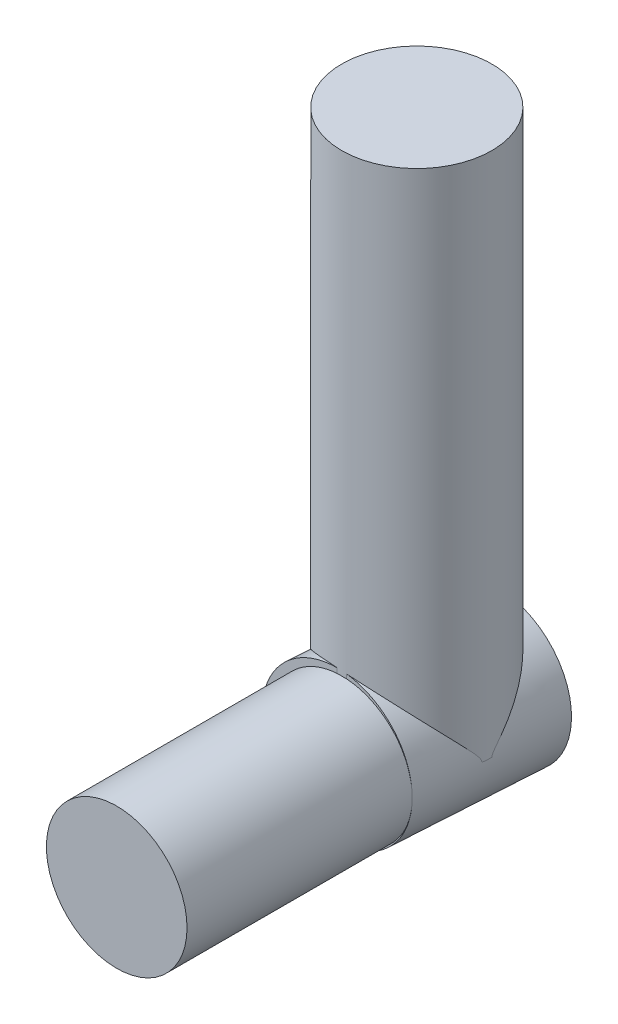
ISO-10303-21;
HEADER;
FILE_DESCRIPTION(('STEP AP214'),'2;1');
FILE_NAME('part.step','',(''),(''),'','','');
FILE_SCHEMA(('AUTOMOTIVE_DESIGN { 1 0 10303 214 1 1 1 1 }'));
ENDSEC;
DATA;
#1=APPLICATION_CONTEXT('core data for automotive mechanical design processes');
#2=APPLICATION_PROTOCOL_DEFINITION('international standard','automotive_design',2000,#1);
#3=PRODUCT_CONTEXT('',#1,'mechanical');
#4=PRODUCT('Part','Part','',(#3));
#5=PRODUCT_RELATED_PRODUCT_CATEGORY('part','',(#4));
#6=PRODUCT_DEFINITION_FORMATION('','',#4);
#7=PRODUCT_DEFINITION_CONTEXT('part definition',#1,'design');
#8=PRODUCT_DEFINITION('design','',#6,#7);
#9=PRODUCT_DEFINITION_SHAPE('','',#8);
#10=(LENGTH_UNIT() NAMED_UNIT(*) SI_UNIT(.MILLI.,.METRE.));
#11=(NAMED_UNIT(*) PLANE_ANGLE_UNIT() SI_UNIT($,.RADIAN.));
#12=(NAMED_UNIT(*) SI_UNIT($,.STERADIAN.) SOLID_ANGLE_UNIT());
#13=UNCERTAINTY_MEASURE_WITH_UNIT(LENGTH_MEASURE(1.E-05),#10,'distance_accuracy_value','');
#14=(GEOMETRIC_REPRESENTATION_CONTEXT(3) GLOBAL_UNCERTAINTY_ASSIGNED_CONTEXT((#13)) GLOBAL_UNIT_ASSIGNED_CONTEXT((#10,
#11,#12)) REPRESENTATION_CONTEXT('',''));
#15=CARTESIAN_POINT('',(0.,0.,0.));
#16=DIRECTION('',(0.,0.,1.));
#17=DIRECTION('',(1.,0.,0.));
#18=AXIS2_PLACEMENT_3D('',#15,#16,#17);
#19=CARTESIAN_POINT('',(0.,70.,0.));
#20=DIRECTION('',(0.,-1.,0.));
#21=DIRECTION('',(0.,0.,-1.));
#22=AXIS2_PLACEMENT_3D('',#19,#20,#21);
#23=CYLINDRICAL_SURFACE('',#22,10.);
#24=CARTESIAN_POINT('',(0.,70.,0.));
#25=DIRECTION('',(0.,1.,0.));
#26=DIRECTION('',(0.,0.,1.));
#27=AXIS2_PLACEMENT_3D('',#24,#25,#26);
#28=CIRCLE('',#27,10.);
#29=CARTESIAN_POINT('',(0.,70.,10.));
#30=VERTEX_POINT('',#29);
#31=EDGE_CURVE('E130',#30,#30,#28,.T.);
#32=ORIENTED_EDGE('',*,*,#31,.F.);
#33=EDGE_LOOP('',(#32));
#34=FACE_BOUND('',#33,.T.);
#35=CARTESIAN_POINT('',(0.631150203700423,9.34756631032858,9.98006259601456));
#36=CARTESIAN_POINT('',(0.420766802466949,9.36175530097585,9.99335419867152));
#37=CARTESIAN_POINT('',(0.210383401233475,9.36884979629949,10.));
#38=CARTESIAN_POINT('',(-0.210383401233474,9.36884979629949,10.));
#39=CARTESIAN_POINT('',(-0.420766802466949,9.36175530097585,9.99335419867152));
#40=CARTESIAN_POINT('',(-0.631150203700423,9.34756631032858,9.98006259601456));
#41=B_SPLINE_CURVE_WITH_KNOTS('',3,(#35,#36,#37,#38,#39,#40),.UNSPECIFIED.,.F.,.F.,(4,2,4),(0.,
0.631823603930589,1.26364720786118),.UNSPECIFIED.);
#42=CARTESIAN_POINT('',(0.631150203700456,9.34756631032858,9.98006259601456));
#43=VERTEX_POINT('',#42);
#44=CARTESIAN_POINT('',(-0.631150203700456,9.34756631032858,9.98006259601456));
#45=VERTEX_POINT('',#44);
#46=EDGE_CURVE('E107',#43,#45,#41,.T.);
#47=ORIENTED_EDGE('',*,*,#46,.F.);
#48=DIRECTION('',(0.,-1.,0.));
#49=VECTOR('',#48,1.);
#50=CARTESIAN_POINT('',(0.631150203700456,70.,9.98006259601456));
#51=LINE('',#50,#49);
#52=CARTESIAN_POINT('',(0.63115020370051,9.92000996377903,9.98006259601456));
#53=VERTEX_POINT('',#52);
#54=EDGE_CURVE('E116',#43,#53,#51,.F.);
#55=ORIENTED_EDGE('',*,*,#54,.T.);
#56=CARTESIAN_POINT('',(9.92032988407377,0.,1.25978370808361));
#57=CARTESIAN_POINT('',(9.92033242590106,0.0220756947974421,1.2597580282637));
#58=CARTESIAN_POINT('',(9.92018434000406,0.0441330122335639,1.26092989339208));
#59=CARTESIAN_POINT('',(9.91960776810244,0.0879510900172992,1.26546063143334));
#60=CARTESIAN_POINT('',(9.91918016515472,0.109712564718145,1.26881261669194));
#61=CARTESIAN_POINT('',(9.91807788951999,0.152328884043128,1.27739887250201));
#62=CARTESIAN_POINT('',(9.91740907290019,0.17319308715758,1.2825884799329));
#63=CARTESIAN_POINT('',(9.91585074428951,0.214453616032157,1.29458148435278));
#64=CARTESIAN_POINT('',(9.91496106127473,0.234849565775109,1.30138613173844));
#65=CARTESIAN_POINT('',(9.91178649424098,0.29970049418278,1.32542961452679));
#66=CARTESIAN_POINT('',(9.90912316114324,0.343166999184462,1.3452741631965));
#67=CARTESIAN_POINT('',(9.90308570803093,0.427952659449818,1.38902277296422));
#68=CARTESIAN_POINT('',(9.8997101730987,0.469267332894177,1.41293489643182));
#69=CARTESIAN_POINT('',(9.89231736121407,0.551068975588831,1.46380742524056));
#70=CARTESIAN_POINT('',(9.88828845742589,0.591522164228469,1.49081981763636));
#71=CARTESIAN_POINT('',(9.87973010855749,0.67112295519387,1.54652144913589));
#72=CARTESIAN_POINT('',(9.87520117198712,0.710271832136264,1.57520897097219));
#73=CARTESIAN_POINT('',(9.86339809914827,0.806288665779882,1.64781754573088));
#74=CARTESIAN_POINT('',(9.85585262738829,0.862606071147923,1.69241888943977));
#75=CARTESIAN_POINT('',(9.83985315935048,0.973918664803114,1.78309166237687));
#76=CARTESIAN_POINT('',(9.83139894853334,1.02891353709393,1.82916343693821));
#77=CARTESIAN_POINT('',(9.81361558936306,1.13804583686376,1.92229012267825));
#78=CARTESIAN_POINT('',(9.80428529926398,1.19218203485904,1.96934625289695));
#79=CARTESIAN_POINT('',(9.78478420727456,1.29977494566702,2.06405874418065));
#80=CARTESIAN_POINT('',(9.77461337026228,1.35323162997871,2.11171513025653));
#81=CARTESIAN_POINT('',(9.74285117897583,1.51289829880721,2.25531739170683));
#82=CARTESIAN_POINT('',(9.72002040696757,1.61834260674294,2.35184228459749));
#83=CARTESIAN_POINT('',(9.67132756624709,1.82698832241099,2.54464873348263));
#84=CARTESIAN_POINT('',(9.64549380682642,1.9302012867694,2.64092501268894));
#85=CARTESIAN_POINT('',(9.59067367970475,2.13556098676346,2.83354851790667));
#86=CARTESIAN_POINT('',(9.56168983159853,2.23770850395434,2.92989562688068));
#87=CARTESIAN_POINT('',(9.50055895633299,2.44115807863855,3.12243211921485));
#88=CARTESIAN_POINT('',(9.46841258219067,2.5424603060054,3.2186215309843));
#89=CARTESIAN_POINT('',(9.38409598612175,2.7947128727181,3.45861596867457));
#90=CARTESIAN_POINT('',(9.32994158891204,2.94519941853083,3.60221690693083));
#91=CARTESIAN_POINT('',(9.21441494878566,3.24457927293557,3.88823305327413));
#92=CARTESIAN_POINT('',(9.15304123506252,3.39347225010206,4.03064801338898));
#93=CARTESIAN_POINT('',(9.02288324759291,3.68982735484595,4.31415691390242));
#94=CARTESIAN_POINT('',(8.95408609520589,3.83728649580493,4.45524808153196));
#95=CARTESIAN_POINT('',(8.80907783758271,4.13034040535444,4.73550853023783));
#96=CARTESIAN_POINT('',(8.73286715524381,4.27593527975462,4.87467792042342));
#97=CARTESIAN_POINT('',(8.49289175364769,4.70972902210022,5.28891975401268));
#98=CARTESIAN_POINT('',(8.31779343724254,4.99491465937514,5.56070443571077));
#99=CARTESIAN_POINT('',(7.93646256955939,5.55488831602754,6.09258530069025));
#100=CARTESIAN_POINT('',(7.73024785824968,5.82968218114401,6.35268807139074));
#101=CARTESIAN_POINT('',(7.3178786155202,6.32711492077504,6.82138894697784));
#102=CARTESIAN_POINT('',(7.11610275355067,6.55151475092442,7.03196571834002));
#103=CARTESIAN_POINT('',(6.68814409782686,6.98868035011143,7.44017195604492));
#104=CARTESIAN_POINT('',(6.46196140127897,7.20144616547937,7.63780147394831));
#105=CARTESIAN_POINT('',(6.02234550747074,7.58013840160932,7.98731930252009));
#106=CARTESIAN_POINT('',(5.81253901080116,7.74815580163604,8.14150260860614));
#107=CARTESIAN_POINT('',(5.37515669480509,8.07200348770866,8.43665967977126));
#108=CARTESIAN_POINT('',(5.14759268067936,8.22784173481591,8.57764208593553));
#109=CARTESIAN_POINT('',(4.70871530811283,8.50381716113347,8.82507927814656));
#110=CARTESIAN_POINT('',(4.49976185897499,8.62586731065247,8.93358492674006));
#111=CARTESIAN_POINT('',(4.06883498695091,8.85805594853519,9.1379160667814));
#112=CARTESIAN_POINT('',(3.84684166219442,8.96817545905106,9.23372140866351));
#113=CARTESIAN_POINT('',(3.41515055287534,9.16353096962954,9.40130329266466));
#114=CARTESIAN_POINT('',(3.20665937064998,9.25016798566817,9.47455206441438));
#115=CARTESIAN_POINT('',(2.78094600002504,9.41103220547226,9.60812547147538));
#116=CARTESIAN_POINT('',(2.56372589446289,9.48526234812792,9.66845316843443));
#117=CARTESIAN_POINT('',(2.12209870731926,9.6199082367368,9.77487596900084));
#118=CARTESIAN_POINT('',(1.89770566322061,9.68034928212193,9.82099719317577));
#119=CARTESIAN_POINT('',(1.44299831680148,9.7863528020247,9.89802147040868));
#120=CARTESIAN_POINT('',(1.21268955113086,9.83192867843877,9.92893824409036));
#121=CARTESIAN_POINT('',(0.922414064452797,9.87898193016399,9.95753785794868));
#122=CARTESIAN_POINT('',(0.864292668973951,9.88788938100822,9.96275147125723));
#123=CARTESIAN_POINT('',(0.747865039608166,9.90470147025298,9.9721663247041));
#124=CARTESIAN_POINT('',(0.689558963225636,9.9126068049106,9.97636826958197));
#125=CARTESIAN_POINT('',(0.63115020370051,9.92000996377903,9.98006259601456));
#126=B_SPLINE_CURVE_WITH_KNOTS('',3,(#56,#57,#58,#59,#60,#61,#62,#63,#64,#65,#66,#67,#68,#69,
#70,#71,#72,#73,#74,#75,#76,#77,#78,#79,#80,#81,#82,#83,#84,#85,#86,#87,#88,#89,#90,#91,#92,#93,
#94,#95,#96,#97,#98,#99,#100,#101,#102,#103,#104,#105,#106,#107,#108,#109,#110,#111,#112,#113,
#114,#115,#116,#117,#118,#119,#120,#121,#122,#123,#124,#125),.UNSPECIFIED.,.F.,.F.,(4,2,2,2,2,2,
2,2,2,2,2,2,2,2,2,2,2,2,2,2,2,2,2,2,2,2,2,2,2,2,2,2,2,2,4),(0.,0.0661661674294887,
0.132124304863384,0.196578450275919,0.26108266111811,0.40423972562996,0.547683921590436,
0.69403733411846,0.840243259632868,1.0568906636945,1.27358932767939,1.49057443013833,
1.70756860382563,2.14180624545537,2.57223956623243,3.00233110445249,3.4323340204946,
4.07702404328514,4.72184563835633,5.36780446469225,6.01372646454948,7.30566760756282,
8.59687083650684,9.69973485431071,10.8025944798424,11.7313019179533,12.6593971267508,
13.4542005711128,14.2502502858769,14.9615622734043,15.6727055286849,16.382533334355,
17.0917194046606,17.2688006524312,17.4457581841745),.UNSPECIFIED.);
#127=CARTESIAN_POINT('',(9.92032988407376,0.,1.25978370808369));
#128=VERTEX_POINT('',#127);
#129=EDGE_CURVE('E153',#128,#53,#126,.T.);
#130=ORIENTED_EDGE('',*,*,#129,.F.);
#131=CARTESIAN_POINT('',(0.,0.,0.));
#132=DIRECTION('',(0.,1.,0.));
#133=DIRECTION('',(0.,0.,1.));
#134=AXIS2_PLACEMENT_3D('',#131,#132,#133);
#135=CIRCLE('',#134,10.);
#136=CARTESIAN_POINT('',(10.,0.,0.));
#137=VERTEX_POINT('',#136);
#138=EDGE_CURVE('E134',#128,#137,#135,.T.);
#139=ORIENTED_EDGE('',*,*,#138,.T.);
#140=CARTESIAN_POINT('',(0.631150203700509,10.,-9.98006259601456));
#141=CARTESIAN_POINT('',(0.742830827548324,10.0000016296547,-9.97300142290277));
#142=CARTESIAN_POINT('',(0.854375283150213,9.99811355991187,-9.96406291506445));
#143=CARTESIAN_POINT('',(1.0769692283195,9.99057907109058,-9.9424663750549));
#144=CARTESIAN_POINT('',(1.18801874837057,9.98493288679144,-9.92980857526523));
#145=CARTESIAN_POINT('',(1.5198832449709,9.96240390075529,-9.88633722595227));
#146=CARTESIAN_POINT('',(1.73964574342517,9.93993057480389,-9.85001098964358));
#147=CARTESIAN_POINT('',(2.17241386215286,9.88082076235326,-9.76365243273368));
#148=CARTESIAN_POINT('',(2.38546199110751,9.84431098802128,-9.71374386988338));
#149=CARTESIAN_POINT('',(2.80531306092513,9.75784954291677,-9.60091000635828));
#150=CARTESIAN_POINT('',(3.01211511229863,9.70789596758853,-9.53798286166005));
#151=CARTESIAN_POINT('',(3.41749632595821,9.59565032439707,-9.40034064242018));
#152=CARTESIAN_POINT('',(3.61609966127069,9.53339820983808,-9.32566389376065));
#153=CARTESIAN_POINT('',(4.00488643798395,9.39744967447637,-9.16543047318063));
#154=CARTESIAN_POINT('',(4.19506666756992,9.3237489356663,-9.07986969841289));
#155=CARTESIAN_POINT('',(4.56665822987374,9.16580006838072,-8.89878923526076));
#156=CARTESIAN_POINT('',(4.74804884113436,9.08152855097958,-8.80324754397401));
#157=CARTESIAN_POINT('',(5.10116090673585,8.90362239277449,-8.60344850511416));
#158=CARTESIAN_POINT('',(5.27288146628553,8.80998688771813,-8.49919035319829));
#159=CARTESIAN_POINT('',(5.67486116939111,8.57419780331867,-8.23859836688425));
#160=CARTESIAN_POINT('',(5.90023325614168,8.4278993818153,-8.07844809391049));
#161=CARTESIAN_POINT('',(6.33104896877123,8.12125437339223,-7.74544950253409));
#162=CARTESIAN_POINT('',(6.53649076127022,7.96090649664589,-7.57260001850127));
#163=CARTESIAN_POINT('',(6.92779073009154,7.62831620838957,-7.21635274799484));
#164=CARTESIAN_POINT('',(7.1136408669042,7.45606896155133,-7.03295067858041));
#165=CARTESIAN_POINT('',(7.46607800043684,7.10169946358894,-6.65762263848096));
#166=CARTESIAN_POINT('',(7.63267077994541,6.91958020118758,-6.46569925074758));
#167=CARTESIAN_POINT('',(7.95028262635964,6.54342908192741,-6.07111000641651));
#168=CARTESIAN_POINT('',(8.10094064734987,6.3492355015338,-5.86830855038069));
#169=CARTESIAN_POINT('',(8.38341993447173,5.9538611548067,-5.45714315324223));
#170=CARTESIAN_POINT('',(8.51526322409773,5.75268890612465,-5.24878606018127));
#171=CARTESIAN_POINT('',(8.821935266842,5.24300428664017,-4.72298356628904));
#172=CARTESIAN_POINT('',(8.98566402740072,4.93072728890385,-4.40267311983434));
#173=CARTESIAN_POINT('',(9.2749947133202,4.29552032877061,-3.75504362114587));
#174=CARTESIAN_POINT('',(9.40056368174093,3.97258142346712,-3.42771877055008));
#175=CARTESIAN_POINT('',(9.58598218136611,3.40704232997325,-2.85876762507608));
#176=CARTESIAN_POINT('',(9.65441962841038,3.16639299835617,-2.61796159946066));
#177=CARTESIAN_POINT('',(9.74283946381923,2.802431333076,-2.25664173398793));
#178=CARTESIAN_POINT('',(9.76992811283642,2.68068624734011,-2.13625505755867));
#179=CARTESIAN_POINT('',(9.81944642684829,2.43608177191856,-1.89566819860734));
#180=CARTESIAN_POINT('',(9.84187635959484,2.31322244669575,-1.77546800576176));
#181=CARTESIAN_POINT('',(9.88658407932886,2.03896526327545,-1.5091259133524));
#182=CARTESIAN_POINT('',(9.90773543002318,1.88725408540976,-1.3631143380007));
#183=CARTESIAN_POINT('',(9.93444594291909,1.65739174011257,-1.14549414771198));
#184=CARTESIAN_POINT('',(9.94252106698222,1.58027975755807,-1.0730874476194));
#185=CARTESIAN_POINT('',(9.95700206077707,1.42512603751127,-0.929156117581981));
#186=CARTESIAN_POINT('',(9.96340851463875,1.3470846353999,-0.85763118734258));
#187=CARTESIAN_POINT('',(9.9721277291919,1.22425647926387,-0.74716380547574));
#188=CARTESIAN_POINT('',(9.97500136483186,1.1799478852086,-0.707733480832518));
#189=CARTESIAN_POINT('',(9.98024560109061,1.09074629701172,-0.629472011340692));
#190=CARTESIAN_POINT('',(9.9826160285646,1.04585310734227,-0.590641076979192));
#191=CARTESIAN_POINT('',(9.9868667156041,0.955252830355158,-0.513785892912599));
#192=CARTESIAN_POINT('',(9.98874631568864,0.90954473526087,-0.475762790954648));
#193=CARTESIAN_POINT('',(9.99202439689919,0.817192190859294,-0.401050613616653));
#194=CARTESIAN_POINT('',(9.99342393134944,0.770550032287507,-0.364358777641774));
#195=CARTESIAN_POINT('',(9.99577262884016,0.675854804941674,-0.292924175962336));
#196=CARTESIAN_POINT('',(9.99672227012489,0.627803292317865,-0.258179375336574));
#197=CARTESIAN_POINT('',(9.99821477187555,0.529656915104847,-0.191812543147));
#198=CARTESIAN_POINT('',(9.99875845383924,0.47956639456944,-0.160184318160942));
#199=CARTESIAN_POINT('',(9.99929950150752,0.406126183735247,-0.119006955372882));
#200=CARTESIAN_POINT('',(9.9994310732103,0.384027828579707,-0.107250090774236));
#201=CARTESIAN_POINT('',(9.99964503752539,0.339210303455327,-0.0849860055166155));
#202=CARTESIAN_POINT('',(9.99972741478707,0.316490942018041,-0.0744791757364691));
#203=CARTESIAN_POINT('',(9.99991494109074,0.2476467589789,-0.0454984574862729));
#204=CARTESIAN_POINT('',(9.99996299632667,0.200449244933722,-0.0293344842347645));
#205=CARTESIAN_POINT('',(9.99999436676468,0.127323502902867,-0.0122439245373491));
#206=CARTESIAN_POINT('',(9.99999781613364,0.102235030998736,-0.00773040878097081));
#207=CARTESIAN_POINT('',(10.0000000169605,0.0514487318273774,-0.00157214493102014));
#208=CARTESIAN_POINT('',(9.99999871904256,0.0257472782050244,4.21900316416995E-05));
#209=CARTESIAN_POINT('',(10.,0.,0.));
#210=B_SPLINE_CURVE_WITH_KNOTS('',3,(#140,#141,#142,#143,#144,#145,#146,#147,#148,#149,#150,
#151,#152,#153,#154,#155,#156,#157,#158,#159,#160,#161,#162,#163,#164,#165,#166,#167,#168,#169,
#170,#171,#172,#173,#174,#175,#176,#177,#178,#179,#180,#181,#182,#183,#184,#185,#186,#187,#188,
#189,#190,#191,#192,#193,#194,#195,#196,#197,#198,#199,#200,#201,#202,#203,#204,#205,#206,#207,
#208,#209),.UNSPECIFIED.,.F.,.F.,(4,2,2,2,2,2,2,2,2,2,2,2,2,2,2,2,2,2,2,2,2,2,2,2,2,2,2,2,2,2,2,
2,2,2,4),(0.,0.335644816483024,0.671268666315846,1.34182303228847,2.00646104374489,
2.67119326271525,3.33380051250744,3.99665828332755,4.66100945728201,5.32542200444095,
6.2624184420944,7.19950099211419,8.13696659275179,9.07414994665347,10.0293535710691,
10.9834297502721,12.4105671132785,13.8389335521589,14.8801268340346,15.4001043190678,
15.920051910996,16.554768981225,16.8730119563582,17.1911433780795,17.3692844942889,
17.5474868066284,17.7259273356862,17.9039738012135,18.0818305732003,18.259326452166,
18.3343831740585,18.4094633044202,18.5582814783205,18.6346004405035,18.7117154321762),.UNSPECIFIED.);
#211=CARTESIAN_POINT('',(0.631150203700509,10.,-9.98006259601456));
#212=VERTEX_POINT('',#211);
#213=EDGE_CURVE('E186',#212,#137,#210,.T.);
#214=ORIENTED_EDGE('',*,*,#213,.F.);
#215=DIRECTION('',(0.,-1.,0.));
#216=VECTOR('',#215,1.);
#217=CARTESIAN_POINT('',(0.631150203700563,70.,-9.98006259601455));
#218=LINE('',#217,#216);
#219=CARTESIAN_POINT('',(0.631150203700563,0.,-9.98006259601455));
#220=VERTEX_POINT('',#219);
#221=EDGE_CURVE('E126',#220,#212,#218,.F.);
#222=ORIENTED_EDGE('',*,*,#221,.F.);
#223=CARTESIAN_POINT('',(-0.631150203700563,0.,-9.98006259601455));
#224=VERTEX_POINT('',#223);
#225=EDGE_CURVE('E137',#220,#224,#135,.T.);
#226=ORIENTED_EDGE('',*,*,#225,.T.);
#227=DIRECTION('',(0.,-1.,0.));
#228=VECTOR('',#227,1.);
#229=CARTESIAN_POINT('',(-0.631150203700563,70.,-9.98006259601455));
#230=LINE('',#229,#228);
#231=CARTESIAN_POINT('',(-0.631150203700509,9.92000996377903,-9.98006259601456));
#232=VERTEX_POINT('',#231);
#233=EDGE_CURVE('E73',#232,#224,#230,.T.);
#234=ORIENTED_EDGE('',*,*,#233,.F.);
#235=CARTESIAN_POINT('',(-9.92032988407376,0.,-1.25978370808371));
#236=CARTESIAN_POINT('',(-9.92033242590089,0.0220756944200835,-1.25975802826538));
#237=CARTESIAN_POINT('',(-9.92018434000902,0.0441330114800429,-1.26092989335294));
#238=CARTESIAN_POINT('',(-9.91960776812691,0.0879510885264132,-1.2654606312413));
#239=CARTESIAN_POINT('',(-9.91918016519349,0.109712562865994,-1.2688126163883));
#240=CARTESIAN_POINT('',(-9.91807788957613,0.152328882219806,-1.27739887206618));
#241=CARTESIAN_POINT('',(-9.91740907295069,0.173193085710287,-1.28258847954278));
#242=CARTESIAN_POINT('',(-9.91585074432053,0.214453615320937,-1.29458148411555));
#243=CARTESIAN_POINT('',(-9.9149610612919,0.234849565423915,-1.30138613160846));
#244=CARTESIAN_POINT('',(-9.91178649415435,0.299700495953271,-1.32542961518274));
#245=CARTESIAN_POINT('',(-9.90912316093255,0.343167002626961,-1.34527416476542));
#246=CARTESIAN_POINT('',(-9.90308570752349,0.427952666090454,-1.38902277659868));
#247=CARTESIAN_POINT('',(-9.89971017241835,0.469267341060141,-1.4129349012202));
#248=CARTESIAN_POINT('',(-9.89231736044091,0.55106898349435,-1.46380743045198));
#249=CARTESIAN_POINT('',(-9.88828845677854,0.591522170481273,-1.49081982191145));
#250=CARTESIAN_POINT('',(-9.87973010820402,0.671122958250266,-1.54652145137443));
#251=CARTESIAN_POINT('',(-9.8752011718018,0.710271833649113,-1.57520897211031));
#252=CARTESIAN_POINT('',(-9.86339810218623,0.806288641058463,-1.64781752704515));
#253=CARTESIAN_POINT('',(-9.85585263389267,0.862606022565358,-1.69241885100586));
#254=CARTESIAN_POINT('',(-9.83985317354214,0.973918569388297,-1.7830915835264));
#255=CARTESIAN_POINT('',(-9.83139896694624,1.02891341870853,-1.82916333741884));
#256=CARTESIAN_POINT('',(-9.81361561694435,1.13804567299966,-1.92228998134257));
#257=CARTESIAN_POINT('',(-9.80428533179382,1.192181848488,-1.96934609041284));
#258=CARTESIAN_POINT('',(-9.78478425040218,1.29977471460484,-2.06405853921852));
#259=CARTESIAN_POINT('',(-9.77461341903919,1.35323137673235,-2.11171490396479));
#260=CARTESIAN_POINT('',(-9.74285124574329,1.51289797931688,-2.25531710135167));
#261=CARTESIAN_POINT('',(-9.72002048711684,1.6183422435083,-2.35184195144194));
#262=CARTESIAN_POINT('',(-9.67132765477561,1.82698796265978,-2.54464839861844));
#263=CARTESIAN_POINT('',(-9.64549388756345,1.93020097311254,-2.64092471942922));
#264=CARTESIAN_POINT('',(-9.59067374209725,2.13556076423898,-2.83354830823876));
#265=CARTESIAN_POINT('',(-9.56168988343988,2.2377083264686,-2.92989545919979));
#266=CARTESIAN_POINT('',(-9.50055898432101,2.44115799044133,-3.12243203546727));
#267=CARTESIAN_POINT('',(-9.46841259687738,2.54246026205821,-3.21862148918302));
#268=CARTESIAN_POINT('',(-9.38409585075243,2.79471327771945,-3.45861635397956));
#269=CARTESIAN_POINT('',(-9.32994129903927,2.94520022410825,-3.60221767556707));
#270=CARTESIAN_POINT('',(-9.21441431100325,3.24458087132026,-3.88823458126433));
#271=CARTESIAN_POINT('',(-9.15304040385637,3.39347424071402,-4.0306499173987));
#272=CARTESIAN_POINT('',(-9.02288233791151,3.6898293278681,-4.31415880171362));
#273=CARTESIAN_POINT('',(-8.9540853395428,3.83728806806916,-4.45524958553341));
#274=CARTESIAN_POINT('',(-8.80907742958408,4.13034118479702,-4.73550927526896));
#275=CARTESIAN_POINT('',(-8.73286694094728,4.27593566714748,-4.87467829030844));
#276=CARTESIAN_POINT('',(-8.49289383418752,4.70972526115769,-5.2889161626776));
#277=CARTESIAN_POINT('',(-8.3177979927538,4.99490723908216,-5.56069736460844));
#278=CARTESIAN_POINT('',(-7.93646793921586,5.55488116100526,-6.09257852785083));
#279=CARTESIAN_POINT('',(-7.73025075494216,5.82967868460689,-6.35268477667892));
#280=CARTESIAN_POINT('',(-7.31786799906238,6.32712772917252,-6.82140101567437));
#281=CARTESIAN_POINT('',(-7.1160801989261,6.55153984234549,-7.03198926435121));
#282=CARTESIAN_POINT('',(-6.68811879592164,6.98870414504929,-7.44019405798244));
#283=CARTESIAN_POINT('',(-6.46194801744289,7.20145768074838,-7.63781210107659));
#284=CARTESIAN_POINT('',(-6.0223901395807,7.58009996639364,-7.98728382919586));
#285=CARTESIAN_POINT('',(-5.81263224939142,7.74808116543375,-8.14143412034619));
#286=CARTESIAN_POINT('',(-5.37525775218112,8.07193425598446,-8.43659704521164));
#287=CARTESIAN_POINT('',(-5.14764500438551,8.22780874987389,-8.57761250361094));
#288=CARTESIAN_POINT('',(-4.7085435337465,8.50392524736081,-8.82517619444833));
#289=CARTESIAN_POINT('',(-4.49940753143595,8.62607448741252,-8.93376913507893));
#290=CARTESIAN_POINT('',(-4.06845747863444,8.85824306152599,-9.13807883841533));
#291=CARTESIAN_POINT('',(-3.84664507989666,8.96826397048012,-9.23379727326222));
#292=CARTESIAN_POINT('',(-3.41851075655421,9.16201075344572,-9.39999926067987));
#293=CARTESIAN_POINT('',(-3.21354028425203,9.24730766325172,-9.47213360534377));
#294=CARTESIAN_POINT('',(-2.79513381068954,9.40591830652852,-9.6039203798487));
#295=CARTESIAN_POINT('',(-2.58170044059291,9.47923572874758,-9.66357665355391));
#296=CARTESIAN_POINT('',(-2.22536901798484,9.58873014899586,-9.75029679135628));
#297=CARTESIAN_POINT('',(-2.08462198391163,9.62879776101438,-9.78137701252697));
#298=CARTESIAN_POINT('',(-1.80044490371574,9.703202035825,-9.83765087568719));
#299=CARTESIAN_POINT('',(-1.65701481602671,9.73753860974895,-9.86284442639767));
#300=CARTESIAN_POINT('',(-1.36752410467994,9.80026990914788,-9.90713696958234));
#301=CARTESIAN_POINT('',(-1.22145756356051,9.82864879862337,-9.92621978815998));
#302=CARTESIAN_POINT('',(-0.927524089160697,9.87911327057854,-9.95799198593877));
#303=CARTESIAN_POINT('',(-0.779656795950375,9.90119757264694,-9.97068006475886));
#304=CARTESIAN_POINT('',(-0.631150203700509,9.92000996377903,-9.98006259601455));
#305=B_SPLINE_CURVE_WITH_KNOTS('',3,(#235,#236,#237,#238,#239,#240,#241,#242,#243,#244,#245,
#246,#247,#248,#249,#250,#251,#252,#253,#254,#255,#256,#257,#258,#259,#260,#261,#262,#263,#264,
#265,#266,#267,#268,#269,#270,#271,#272,#273,#274,#275,#276,#277,#278,#279,#280,#281,#282,#283,
#284,#285,#286,#287,#288,#289,#290,#291,#292,#293,#294,#295,#296,#297,#298,#299,#300,#301,#302,
#303,#304),.UNSPECIFIED.,.F.,.F.,(4,2,2,2,2,2,2,2,2,2,2,2,2,2,2,2,2,2,2,2,2,2,2,2,2,2,2,2,2,2,2,
2,2,2,4),(0.,0.066166166300848,0.132124302617465,0.196578449152541,0.261082661118873,
0.404239731299089,0.547683932970211,0.694037339817225,0.840243259625819,1.05689057028045,
1.27358914078783,1.49057414953474,1.70756822950141,2.14180568365801,2.57223919179466,
3.00233091726676,3.4323340204847,4.07702576865232,4.72184909031347,5.36780619316828,
6.01372646457642,7.30565081079571,8.59687083512696,9.69979646966771,10.8025944843895,
11.7310958683909,12.6593971121977,13.4548754285433,14.2502503281772,14.9498394969772,
15.6492128392199,16.0978015685897,16.5463972533406,16.9961706517476,17.4460354754641),.UNSPECIFIED.);
#306=CARTESIAN_POINT('',(-9.92032988407376,0.,-1.25978370808369));
#307=VERTEX_POINT('',#306);
#308=EDGE_CURVE('E144',#307,#232,#305,.T.);
#309=ORIENTED_EDGE('',*,*,#308,.F.);
#310=CARTESIAN_POINT('',(-10.,0.,0.));
#311=VERTEX_POINT('',#310);
#312=EDGE_CURVE('E124',#307,#311,#135,.T.);
#313=ORIENTED_EDGE('',*,*,#312,.T.);
#314=CARTESIAN_POINT('',(-0.631150203700509,10.,9.98006259601456));
#315=CARTESIAN_POINT('',(-0.742758149923644,10.0000016276289,9.97300601707883));
#316=CARTESIAN_POINT('',(-0.854230130237675,9.99811601587836,9.96407454576836));
#317=CARTESIAN_POINT('',(-1.07668125265294,9.99059127050558,9.94249676201119));
#318=CARTESIAN_POINT('',(-1.18766041937526,9.98495232657392,9.92985063731827));
#319=CARTESIAN_POINT('',(-1.51931905929919,9.96245192124192,9.88642082983021));
#320=CARTESIAN_POINT('',(-1.73894776000087,9.94000679694831,9.85013119970352));
#321=CARTESIAN_POINT('',(-2.17173220803786,9.8809327751913,9.76380732537902));
#322=CARTESIAN_POINT('',(-2.38492434141924,9.84441240410824,9.71387907855687));
#323=CARTESIAN_POINT('',(-2.80505214283456,9.75791256156799,9.60098939349507));
#324=CARTESIAN_POINT('',(-3.01198703658108,9.70793143196029,9.53802634979774));
#325=CARTESIAN_POINT('',(-3.4176652379892,9.59560355289965,9.40028328881789));
#326=CARTESIAN_POINT('',(-3.61643121414533,9.5332942702426,9.3255392121998));
#327=CARTESIAN_POINT('',(-4.00546089994246,9.39723677212445,9.1651817202485));
#328=CARTESIAN_POINT('',(-4.195724345019,9.32348820103765,9.07956796701275));
#329=CARTESIAN_POINT('',(-4.5672787619355,9.16551738762435,8.89846798296372));
#330=CARTESIAN_POINT('',(-4.74855860792744,9.08128259040066,8.80296994144107));
#331=CARTESIAN_POINT('',(-5.10142327148408,8.90347930826906,8.60328919063252));
#332=CARTESIAN_POINT('',(-5.27300921151289,8.80991190747382,8.49910749030578));
#333=CARTESIAN_POINT('',(-5.67174389881212,8.5760263674831,8.24061927322761));
#334=CARTESIAN_POINT('',(-5.89425618937352,8.43177690908555,8.08269299830155));
#335=CARTESIAN_POINT('',(-6.31966579224686,8.12971844663856,7.75460821812254));
#336=CARTESIAN_POINT('',(-6.52258075675446,7.97192189175112,7.5844609663935));
#337=CARTESIAN_POINT('',(-6.90908464339513,7.64495752759107,7.23412076956715));
#338=CARTESIAN_POINT('',(-7.09269417792869,7.47580216903739,7.05393885957352));
#339=CARTESIAN_POINT('',(-7.4413214069258,7.12775654293307,6.68514375123963));
#340=CARTESIAN_POINT('',(-7.60633469457635,6.94886398275833,6.49652856916839));
#341=CARTESIAN_POINT('',(-7.91814320670858,6.58308560921849,6.11261834676205));
#342=CARTESIAN_POINT('',(-8.06495506824919,6.39620730854444,5.91732961785902));
#343=CARTESIAN_POINT('',(-8.34109424455289,6.01564936647686,5.52126933253281));
#344=CARTESIAN_POINT('',(-8.47042530376932,5.82197119287454,5.32049896140839));
#345=CARTESIAN_POINT('',(-8.77685463248642,5.32379928492696,4.80606424757559));
#346=CARTESIAN_POINT('',(-8.94256754688385,5.01537290244954,4.48938059023117));
#347=CARTESIAN_POINT('',(-9.23652175372566,4.3875140741341,3.84852757674224));
#348=CARTESIAN_POINT('',(-9.36469411967934,4.06806257237558,3.52434561580502));
#349=CARTESIAN_POINT('',(-9.55781691327577,3.50021938463211,2.95220757691947));
#350=CARTESIAN_POINT('',(-9.63056331035387,3.25362582813868,2.70506680013323));
#351=CARTESIAN_POINT('',(-9.72447803533855,2.88116216896209,2.33465911297553));
#352=CARTESIAN_POINT('',(-9.75318680257655,2.7569458022783,2.21159999319609));
#353=CARTESIAN_POINT('',(-9.80572115516537,2.50738236718356,1.96561433016977));
#354=CARTESIAN_POINT('',(-9.82954749396185,2.38203547635419,1.84268776938348));
#355=CARTESIAN_POINT('',(-9.85968935924293,2.20472966566567,1.67005972560758));
#356=CARTESIAN_POINT('',(-9.86801289727234,2.15331151859709,1.62014516169662));
#357=CARTESIAN_POINT('',(-9.88386746707432,2.05022946079618,1.52043154846812));
#358=CARTESIAN_POINT('',(-9.8913984106797,1.99856552338917,1.47063251260307));
#359=CARTESIAN_POINT('',(-9.90567446576924,1.89494760353094,1.37118126120998));
#360=CARTESIAN_POINT('',(-9.91241925527733,1.84299351130932,1.32152911389875));
#361=CARTESIAN_POINT('',(-9.9252384710735,1.737841677188,1.22156677875243));
#362=CARTESIAN_POINT('',(-9.93129875883263,1.68463830567989,1.17126069396318));
#363=CARTESIAN_POINT('',(-9.94261144544459,1.57786456825323,1.07099111902447));
#364=CARTESIAN_POINT('',(-9.94786416749019,1.52429435815858,1.02102749950712));
#365=CARTESIAN_POINT('',(-9.95756542755404,1.41675054816892,0.921618285194359));
#366=CARTESIAN_POINT('',(-9.9620151497467,1.36277766654409,0.872172030589453));
#367=CARTESIAN_POINT('',(-9.96917583809852,1.26697661115448,0.785464851010357));
#368=CARTESIAN_POINT('',(-9.97204958720383,1.22527840671026,0.748073821608851));
#369=CARTESIAN_POINT('',(-9.97734561690299,1.14140622611304,0.673766883318735));
#370=CARTESIAN_POINT('',(-9.9797677451788,1.09923209451188,0.63685113862313));
#371=CARTESIAN_POINT('',(-9.9841735888324,1.01417368675961,0.563584790430321));
#372=CARTESIAN_POINT('',(-9.98615610911747,0.971287807385645,0.527235971303903));
#373=CARTESIAN_POINT('',(-9.98969565891284,0.884490010105496,0.45528434233516));
#374=CARTESIAN_POINT('',(-9.99125038750531,0.840573871516402,0.419686482382435));
#375=CARTESIAN_POINT('',(-9.99388657317875,0.753353996460484,0.351223736618224));
#376=CARTESIAN_POINT('',(-9.99498399467166,0.710092153837336,0.318306397979924));
#377=CARTESIAN_POINT('',(-9.99681313716391,0.622201259302699,0.25444786712401));
#378=CARTESIAN_POINT('',(-9.99754539206744,0.57757430529741,0.22350384786423));
#379=CARTESIAN_POINT('',(-9.99868309247241,0.486636828826785,0.164885738409229));
#380=CARTESIAN_POINT('',(-9.99909078996728,0.44034027957894,0.137190273102659));
#381=CARTESIAN_POINT('',(-9.99965298844598,0.345187492368137,0.0869689252662268));
#382=CARTESIAN_POINT('',(-9.99980890619872,0.29634718491688,0.0644147338757809));
#383=CARTESIAN_POINT('',(-9.99992623684436,0.226456013717125,0.0390842313890883));
#384=CARTESIAN_POINT('',(-9.99994829317783,0.206732808132847,0.0326616791208786));
#385=CARTESIAN_POINT('',(-9.99997875162932,0.166842350339885,0.021358709421393));
#386=CARTESIAN_POINT('',(-9.99998715362065,0.146675094013014,0.016478306298667));
#387=CARTESIAN_POINT('',(-9.99999733880719,0.105562703245201,0.00842876237124854));
#388=CARTESIAN_POINT('',(-9.9999989820289,0.0846101031566247,0.00529696132333076));
#389=CARTESIAN_POINT('',(-10.0000000045484,0.0424438075331333,0.00106847688272978));
#390=CARTESIAN_POINT('',(-9.99999937749865,0.0212295454677769,-2.24874587678539E-05));
#391=CARTESIAN_POINT('',(-10.0000000000001,-1.45324792451373E-13,4.16333634234435E-13));
#392=B_SPLINE_CURVE_WITH_KNOTS('',3,(#314,#315,#316,#317,#318,#319,#320,#321,#322,#323,#324,
#325,#326,#327,#328,#329,#330,#331,#332,#333,#334,#335,#336,#337,#338,#339,#340,#341,#342,#343,
#344,#345,#346,#347,#348,#349,#350,#351,#352,#353,#354,#355,#356,#357,#358,#359,#360,#361,#362,
#363,#364,#365,#366,#367,#368,#369,#370,#371,#372,#373,#374,#375,#376,#377,#378,#379,#380,#381,
#382,#383,#384,#385,#386,#387,#388,#389,#390,#391),.UNSPECIFIED.,.F.,.F.,(4,2,2,2,2,2,2,2,2,2,2,
2,2,2,2,2,2,2,2,2,2,2,2,2,2,2,2,2,2,2,2,2,2,2,2,2,2,2,4),(0.,0.335426504488752,
0.670836058064849,1.34097230004002,2.00604165516188,2.67119297371133,3.33435303417402,
3.99753371515451,4.66151618322427,5.32542161005922,6.25000194314739,7.17374154210238,
8.09648462934518,9.01944592424038,9.94155726484166,10.8634707716502,12.2778239825112,
13.6947579739271,14.7640016824456,15.2955229262306,15.8269620849519,16.0433868576409,
16.2598356797507,16.4763728411126,16.6967807754626,16.9171002702889,17.137092159129,
17.3053307191849,17.4736259187829,17.6423731745729,17.8120110594417,17.9750948629607,
18.1379395200291,18.299644157444,18.4604356688644,18.5226123314009,18.5847895708153,
18.6482482044973,18.7118844038988),.UNSPECIFIED.);
#393=CARTESIAN_POINT('',(-0.631150203700509,10.,9.98006259601456));
#394=VERTEX_POINT('',#393);
#395=EDGE_CURVE('E147',#394,#311,#392,.T.);
#396=ORIENTED_EDGE('',*,*,#395,.F.);
#397=DIRECTION('',(0.,-1.,0.));
#398=VECTOR('',#397,1.);
#399=CARTESIAN_POINT('',(-0.631150203700456,70.,9.98006259601456));
#400=LINE('',#399,#398);
#401=EDGE_CURVE('E118',#394,#45,#400,.T.);
#402=ORIENTED_EDGE('',*,*,#401,.T.);
#403=EDGE_LOOP('',(#47,#55,#130,#139,#214,#222,#226,#234,#309,#313,#396,#402));
#404=FACE_BOUND('',#403,.T.);
#405=ADVANCED_FACE('F50',(#34,#404),#23,.T.);
#406=CARTESIAN_POINT('',(0.,0.,9.98006259601456));
#407=DIRECTION('',(0.,0.,1.));
#408=DIRECTION('',(1.,0.,0.));
#409=AXIS2_PLACEMENT_3D('',#406,#407,#408);
#410=PLANE('',#409);
#411=CARTESIAN_POINT('',(-0.631150203700511,0.,9.98006259601456));
#412=DIRECTION('',(0.,0.,1.));
#413=DIRECTION('',(1.,0.,0.));
#414=AXIS2_PLACEMENT_3D('',#411,#412,#413);
#415=CIRCLE('',#414,10.);
#416=CARTESIAN_POINT('',(9.36884979629949,0.,9.98006259601456));
#417=VERTEX_POINT('',#416);
#418=EDGE_CURVE('E177',#394,#417,#415,.T.);
#419=ORIENTED_EDGE('',*,*,#418,.T.);
#420=CARTESIAN_POINT('',(0.,0.,9.98006259601456));
#421=DIRECTION('',(0.,0.,1.));
#422=DIRECTION('',(1.,0.,0.));
#423=AXIS2_PLACEMENT_3D('',#420,#421,#422);
#424=CIRCLE('',#423,9.36884979629949);
#425=EDGE_CURVE('E65',#45,#417,#424,.T.);
#426=ORIENTED_EDGE('',*,*,#425,.F.);
#427=ORIENTED_EDGE('',*,*,#401,.F.);
#428=EDGE_LOOP('',(#419,#426,#427));
#429=FACE_BOUND('',#428,.T.);
#430=ADVANCED_FACE('F203',(#429),#410,.T.);
#431=CARTESIAN_POINT('',(0.,0.,0.));
#432=DIRECTION('',(0.,1.,0.));
#433=DIRECTION('',(0.,0.,1.));
#434=AXIS2_PLACEMENT_3D('',#431,#432,#433);
#435=PLANE('',#434);
#436=DIRECTION('',(1.,0.,0.));
#437=VECTOR('',#436,1.);
#438=CARTESIAN_POINT('',(0.,0.,-9.98006259601455));
#439=LINE('',#438,#437);
#440=EDGE_CURVE('E12',#224,#220,#439,.T.);
#441=ORIENTED_EDGE('',*,*,#440,.F.);
#442=ORIENTED_EDGE('',*,*,#225,.F.);
#443=EDGE_LOOP('',(#441,#442));
#444=FACE_BOUND('',#443,.T.);
#445=ADVANCED_FACE('F201',(#444),#435,.F.);
#446=DIRECTION('',(0.0631150203700511,0.,-0.998006259601456));
#447=VECTOR('',#446,1.);
#448=CARTESIAN_POINT('',(-10.6311502037005,0.,9.98006259601456));
#449=LINE('',#448,#447);
#450=EDGE_CURVE('E58',#311,#307,#449,.T.);
#451=ORIENTED_EDGE('',*,*,#450,.F.);
#452=ORIENTED_EDGE('',*,*,#312,.F.);
#453=EDGE_LOOP('',(#451,#452));
#454=FACE_BOUND('',#453,.T.);
#455=ADVANCED_FACE('F150',(#454),#435,.F.);
#456=DIRECTION('',(0.0631150203700511,0.,-0.998006259601456));
#457=VECTOR('',#456,1.);
#458=CARTESIAN_POINT('',(9.36884979629949,0.,9.98006259601456));
#459=LINE('',#458,#457);
#460=EDGE_CURVE('E133',#137,#128,#459,.F.);
#461=ORIENTED_EDGE('',*,*,#460,.F.);
#462=ORIENTED_EDGE('',*,*,#138,.F.);
#463=EDGE_LOOP('',(#461,#462));
#464=FACE_BOUND('',#463,.T.);
#465=ADVANCED_FACE('F204',(#464),#435,.F.);
#466=CARTESIAN_POINT('',(0.,70.,0.));
#467=DIRECTION('',(0.,1.,0.));
#468=DIRECTION('',(0.,0.,1.));
#469=AXIS2_PLACEMENT_3D('',#466,#467,#468);
#470=PLANE('',#469);
#471=ORIENTED_EDGE('',*,*,#31,.T.);
#472=EDGE_LOOP('',(#471));
#473=FACE_BOUND('',#472,.T.);
#474=ADVANCED_FACE('F213',(#473),#470,.T.);
#475=ORIENTED_EDGE('',*,*,#54,.F.);
#476=EDGE_CURVE('E104',#417,#43,#424,.T.);
#477=ORIENTED_EDGE('',*,*,#476,.F.);
#478=EDGE_CURVE('E119',#417,#53,#415,.T.);
#479=ORIENTED_EDGE('',*,*,#478,.T.);
#480=EDGE_LOOP('',(#475,#477,#479));
#481=FACE_BOUND('',#480,.T.);
#482=ADVANCED_FACE('F121',(#481),#410,.T.);
#483=CARTESIAN_POINT('',(1.26230040740102,0.,-9.98006259601455));
#484=DIRECTION('',(0.,0.,1.));
#485=DIRECTION('',(1.,0.,0.));
#486=AXIS2_PLACEMENT_3D('',#483,#484,#485);
#487=PLANE('',#486);
#488=CARTESIAN_POINT('',(0.631150203700511,0.,-9.98006259601456));
#489=DIRECTION('',(0.,0.,1.));
#490=DIRECTION('',(1.,0.,0.));
#491=AXIS2_PLACEMENT_3D('',#488,#489,#490);
#492=CIRCLE('',#491,10.);
#493=EDGE_CURVE('E181',#232,#212,#492,.T.);
#494=ORIENTED_EDGE('',*,*,#493,.F.);
#495=ORIENTED_EDGE('',*,*,#233,.T.);
#496=ORIENTED_EDGE('',*,*,#440,.T.);
#497=ORIENTED_EDGE('',*,*,#221,.T.);
#498=EDGE_LOOP('',(#494,#495,#496,#497));
#499=FACE_BOUND('',#498,.T.);
#500=ADVANCED_FACE('F170',(#499),#487,.F.);
#501=DIRECTION('',(0.0631150203700511,0.,-0.998006259601456));
#502=VECTOR('',#501,1.);
#503=SURFACE_OF_LINEAR_EXTRUSION('',#415,#502);
#504=ORIENTED_EDGE('',*,*,#450,.T.);
#505=ORIENTED_EDGE('',*,*,#308,.T.);
#506=ORIENTED_EDGE('',*,*,#493,.T.);
#507=ORIENTED_EDGE('',*,*,#213,.T.);
#508=ORIENTED_EDGE('',*,*,#460,.T.);
#509=ORIENTED_EDGE('',*,*,#129,.T.);
#510=ORIENTED_EDGE('',*,*,#478,.F.);
#511=ORIENTED_EDGE('',*,*,#418,.F.);
#512=ORIENTED_EDGE('',*,*,#395,.T.);
#513=EDGE_LOOP('',(#504,#505,#506,#507,#508,#509,#510,#511,#512));
#514=FACE_BOUND('',#513,.T.);
#515=ADVANCED_FACE('F142',(#514),#503,.F.);
#516=CARTESIAN_POINT('',(0.,0.,39.9800625960146));
#517=DIRECTION('',(0.,0.,-1.));
#518=DIRECTION('',(-1.,0.,0.));
#519=AXIS2_PLACEMENT_3D('',#516,#517,#518);
#520=CYLINDRICAL_SURFACE('',#519,9.36884979629949);
#521=CARTESIAN_POINT('',(0.,0.,39.9800625960146));
#522=DIRECTION('',(0.,0.,1.));
#523=DIRECTION('',(1.,0.,0.));
#524=AXIS2_PLACEMENT_3D('',#521,#522,#523);
#525=CIRCLE('',#524,9.36884979629949);
#526=CARTESIAN_POINT('',(9.36884979629949,0.,39.9800625960146));
#527=VERTEX_POINT('',#526);
#528=EDGE_CURVE('E112',#527,#527,#525,.T.);
#529=ORIENTED_EDGE('',*,*,#528,.F.);
#530=EDGE_LOOP('',(#529));
#531=FACE_BOUND('',#530,.T.);
#532=ORIENTED_EDGE('',*,*,#476,.T.);
#533=ORIENTED_EDGE('',*,*,#46,.T.);
#534=ORIENTED_EDGE('',*,*,#425,.T.);
#535=EDGE_LOOP('',(#532,#533,#534));
#536=FACE_BOUND('',#535,.T.);
#537=ADVANCED_FACE('F106',(#531,#536),#520,.T.);
#538=CARTESIAN_POINT('',(0.,0.,39.9800625960146));
#539=DIRECTION('',(0.,0.,1.));
#540=DIRECTION('',(1.,0.,0.));
#541=AXIS2_PLACEMENT_3D('',#538,#539,#540);
#542=PLANE('',#541);
#543=ORIENTED_EDGE('',*,*,#528,.T.);
#544=EDGE_LOOP('',(#543));
#545=FACE_BOUND('',#544,.T.);
#546=ADVANCED_FACE('F271',(#545),#542,.T.);
#547=CLOSED_SHELL('',(#405,#430,#445,#455,#465,#474,#482,#500,#515,#537,#546));
#548=MANIFOLD_SOLID_BREP('B2',#547);
#549=ADVANCED_BREP_SHAPE_REPRESENTATION('',(#18,#548),#14);
#550=SHAPE_DEFINITION_REPRESENTATION(#9,#549);
ENDSEC;
END-ISO-10303-21;
